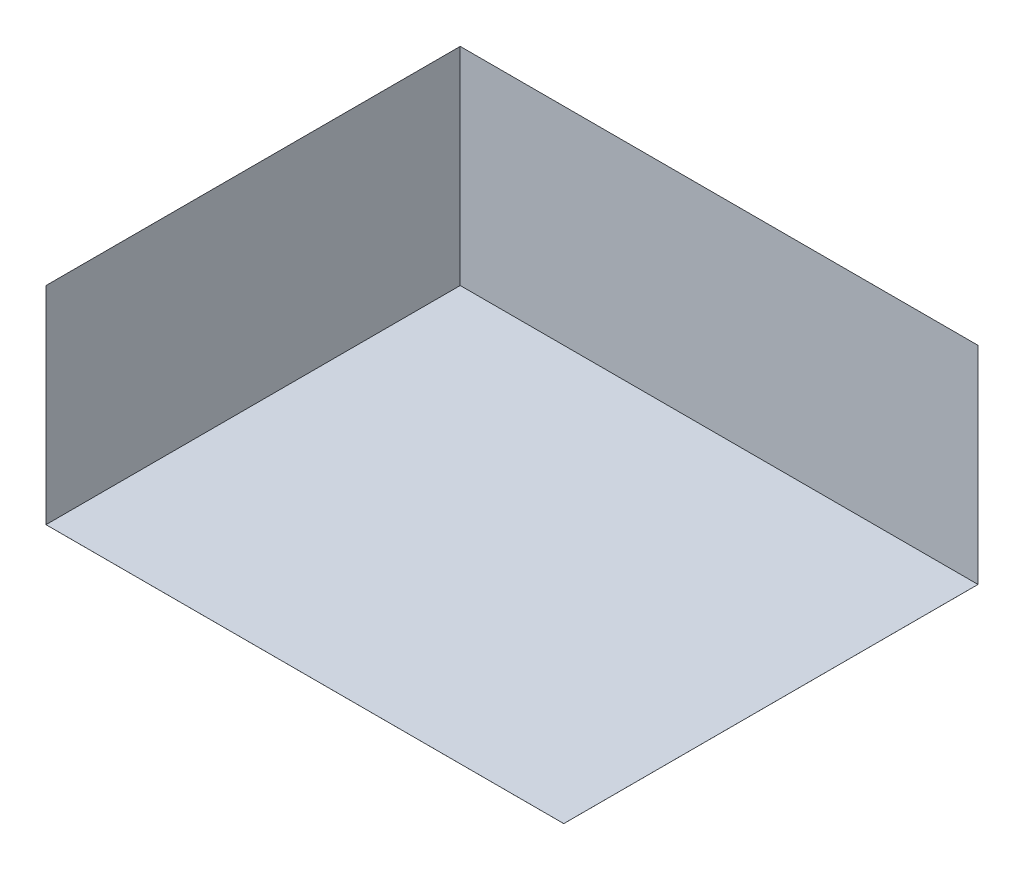
ISO-10303-21;
HEADER;
FILE_DESCRIPTION(('STEP AP214'),'2;1');
FILE_NAME('part.step','',(''),(''),'','','');
FILE_SCHEMA(('AUTOMOTIVE_DESIGN { 1 0 10303 214 1 1 1 1 }'));
ENDSEC;
DATA;
#1=APPLICATION_CONTEXT('core data for automotive mechanical design processes');
#2=APPLICATION_PROTOCOL_DEFINITION('international standard','automotive_design',2000,#1);
#3=PRODUCT_CONTEXT('',#1,'mechanical');
#4=PRODUCT('Part','Part','',(#3));
#5=PRODUCT_RELATED_PRODUCT_CATEGORY('part','',(#4));
#6=PRODUCT_DEFINITION_FORMATION('','',#4);
#7=PRODUCT_DEFINITION_CONTEXT('part definition',#1,'design');
#8=PRODUCT_DEFINITION('design','',#6,#7);
#9=PRODUCT_DEFINITION_SHAPE('','',#8);
#10=(LENGTH_UNIT() NAMED_UNIT(*) SI_UNIT(.MILLI.,.METRE.));
#11=(NAMED_UNIT(*) PLANE_ANGLE_UNIT() SI_UNIT($,.RADIAN.));
#12=(NAMED_UNIT(*) SI_UNIT($,.STERADIAN.) SOLID_ANGLE_UNIT());
#13=UNCERTAINTY_MEASURE_WITH_UNIT(LENGTH_MEASURE(1.E-05),#10,'distance_accuracy_value','');
#14=(GEOMETRIC_REPRESENTATION_CONTEXT(3) GLOBAL_UNCERTAINTY_ASSIGNED_CONTEXT((#13)) GLOBAL_UNIT_ASSIGNED_CONTEXT((#10,
#11,#12)) REPRESENTATION_CONTEXT('',''));
#15=CARTESIAN_POINT('',(0.,0.,0.));
#16=DIRECTION('',(0.,0.,1.));
#17=DIRECTION('',(1.,0.,0.));
#18=AXIS2_PLACEMENT_3D('',#15,#16,#17);
#19=CARTESIAN_POINT('',(-53.3455044386423,2000.254,-19.4976501305483));
#20=DIRECTION('',(1.,0.,0.));
#21=DIRECTION('',(0.,0.,-1.));
#22=AXIS2_PLACEMENT_3D('',#19,#20,#21);
#23=PLANE('',#22);
#24=DIRECTION('',(0.,0.,1.));
#25=VECTOR('',#24,1.);
#26=CARTESIAN_POINT('',(-53.3455044386423,0.254,-19.4976501305483));
#27=LINE('',#26,#25);
#28=CARTESIAN_POINT('',(-53.3455044386423,0.254,-19.4976501305483));
#29=VERTEX_POINT('',#28);
#30=CARTESIAN_POINT('',(-53.3455044386418,0.254,3980.50234986945));
#31=VERTEX_POINT('',#30);
#32=EDGE_CURVE('E111',#29,#31,#27,.T.);
#33=ORIENTED_EDGE('',*,*,#32,.T.);
#34=DIRECTION('',(0.,-1.,0.));
#35=VECTOR('',#34,1.);
#36=CARTESIAN_POINT('',(-53.3455044386418,2000.254,3980.50234986945));
#37=LINE('',#36,#35);
#38=CARTESIAN_POINT('',(-53.3455044386418,2000.254,3980.50234986945));
#39=VERTEX_POINT('',#38);
#40=EDGE_CURVE('E12',#39,#31,#37,.T.);
#41=ORIENTED_EDGE('',*,*,#40,.F.);
#42=DIRECTION('',(0.,0.,1.));
#43=VECTOR('',#42,1.);
#44=CARTESIAN_POINT('',(-53.3455044386423,2000.254,-19.4976501305483));
#45=LINE('',#44,#43);
#46=CARTESIAN_POINT('',(-53.3455044386423,2000.254,-19.4976501305483));
#47=VERTEX_POINT('',#46);
#48=EDGE_CURVE('E88',#47,#39,#45,.T.);
#49=ORIENTED_EDGE('',*,*,#48,.F.);
#50=DIRECTION('',(0.,-1.,0.));
#51=VECTOR('',#50,1.);
#52=CARTESIAN_POINT('',(-53.3455044386423,2000.254,-19.4976501305483));
#53=LINE('',#52,#51);
#54=EDGE_CURVE('E64',#47,#29,#53,.T.);
#55=ORIENTED_EDGE('',*,*,#54,.T.);
#56=EDGE_LOOP('',(#33,#41,#49,#55));
#57=FACE_BOUND('',#56,.T.);
#58=ADVANCED_FACE('F48',(#57),#23,.F.);
#59=CARTESIAN_POINT('',(-53.3201044386418,2000.254,3980.50234986945));
#60=DIRECTION('',(0.,0.,1.));
#61=DIRECTION('',(1.,0.,0.));
#62=AXIS2_PLACEMENT_3D('',#59,#60,#61);
#63=PLANE('',#62);
#64=DIRECTION('',(-1.,0.,0.));
#65=VECTOR('',#64,1.);
#66=CARTESIAN_POINT('',(-53.3201044386418,0.254,3980.50234986945));
#67=LINE('',#66,#65);
#68=CARTESIAN_POINT('',(-53.3201044386418,0.254,3980.50234986945));
#69=VERTEX_POINT('',#68);
#70=EDGE_CURVE('E97',#69,#31,#67,.T.);
#71=ORIENTED_EDGE('',*,*,#70,.F.);
#72=DIRECTION('',(0.,-1.,0.));
#73=VECTOR('',#72,1.);
#74=CARTESIAN_POINT('',(-53.3201044386418,2000.254,3980.50234986945));
#75=LINE('',#74,#73);
#76=CARTESIAN_POINT('',(-53.3201044386418,2000.254,3980.50234986945));
#77=VERTEX_POINT('',#76);
#78=EDGE_CURVE('E56',#77,#69,#75,.T.);
#79=ORIENTED_EDGE('',*,*,#78,.F.);
#80=DIRECTION('',(-1.,0.,0.));
#81=VECTOR('',#80,1.);
#82=CARTESIAN_POINT('',(-53.3201044386418,2000.254,3980.50234986945));
#83=LINE('',#82,#81);
#84=EDGE_CURVE('E95',#77,#39,#83,.T.);
#85=ORIENTED_EDGE('',*,*,#84,.T.);
#86=ORIENTED_EDGE('',*,*,#40,.T.);
#87=EDGE_LOOP('',(#71,#79,#85,#86));
#88=FACE_BOUND('',#87,.T.);
#89=ADVANCED_FACE('F94',(#88),#63,.T.);
#90=CARTESIAN_POINT('',(-53.3201044386423,2000.254,-19.4976501305483));
#91=DIRECTION('',(1.,0.,0.));
#92=DIRECTION('',(0.,0.,-1.));
#93=AXIS2_PLACEMENT_3D('',#90,#91,#92);
#94=PLANE('',#93);
#95=DIRECTION('',(0.,0.,1.));
#96=VECTOR('',#95,1.);
#97=CARTESIAN_POINT('',(-53.3201044386423,0.254,-19.4976501305483));
#98=LINE('',#97,#96);
#99=CARTESIAN_POINT('',(-53.3201044386423,0.254,-19.4976501305483));
#100=VERTEX_POINT('',#99);
#101=EDGE_CURVE('E114',#100,#69,#98,.T.);
#102=ORIENTED_EDGE('',*,*,#101,.F.);
#103=DIRECTION('',(0.,-1.,0.));
#104=VECTOR('',#103,1.);
#105=CARTESIAN_POINT('',(-53.3201044386423,2000.254,-19.4976501305483));
#106=LINE('',#105,#104);
#107=CARTESIAN_POINT('',(-53.3201044386423,2000.254,-19.4976501305483));
#108=VERTEX_POINT('',#107);
#109=EDGE_CURVE('E77',#108,#100,#106,.T.);
#110=ORIENTED_EDGE('',*,*,#109,.F.);
#111=DIRECTION('',(0.,0.,1.));
#112=VECTOR('',#111,1.);
#113=CARTESIAN_POINT('',(-53.3201044386423,2000.254,-19.4976501305483));
#114=LINE('',#113,#112);
#115=EDGE_CURVE('E103',#108,#77,#114,.T.);
#116=ORIENTED_EDGE('',*,*,#115,.T.);
#117=ORIENTED_EDGE('',*,*,#78,.T.);
#118=EDGE_LOOP('',(#102,#110,#116,#117));
#119=FACE_BOUND('',#118,.T.);
#120=ADVANCED_FACE('F105',(#119),#94,.T.);
#121=CARTESIAN_POINT('',(-53.3455044386423,2000.254,-19.4976501305483));
#122=DIRECTION('',(0.,0.,-1.));
#123=DIRECTION('',(-1.,0.,0.));
#124=AXIS2_PLACEMENT_3D('',#121,#122,#123);
#125=PLANE('',#124);
#126=DIRECTION('',(1.,0.,0.));
#127=VECTOR('',#126,1.);
#128=CARTESIAN_POINT('',(-53.3455044386423,0.254,-19.4976501305483));
#129=LINE('',#128,#127);
#130=EDGE_CURVE('E116',#29,#100,#129,.T.);
#131=ORIENTED_EDGE('',*,*,#130,.F.);
#132=ORIENTED_EDGE('',*,*,#54,.F.);
#133=DIRECTION('',(1.,0.,0.));
#134=VECTOR('',#133,1.);
#135=CARTESIAN_POINT('',(-53.3455044386423,2000.254,-19.4976501305483));
#136=LINE('',#135,#134);
#137=EDGE_CURVE('E106',#47,#108,#136,.T.);
#138=ORIENTED_EDGE('',*,*,#137,.T.);
#139=ORIENTED_EDGE('',*,*,#109,.T.);
#140=EDGE_LOOP('',(#131,#132,#138,#139));
#141=FACE_BOUND('',#140,.T.);
#142=ADVANCED_FACE('F122',(#141),#125,.T.);
#143=CARTESIAN_POINT('',(0.,2000.254,0.));
#144=DIRECTION('',(0.,-1.,0.));
#145=DIRECTION('',(-1.,0.,0.));
#146=AXIS2_PLACEMENT_3D('',#143,#144,#145);
#147=PLANE('',#146);
#148=ORIENTED_EDGE('',*,*,#48,.T.);
#149=ORIENTED_EDGE('',*,*,#84,.F.);
#150=ORIENTED_EDGE('',*,*,#115,.F.);
#151=ORIENTED_EDGE('',*,*,#137,.F.);
#152=EDGE_LOOP('',(#148,#149,#150,#151));
#153=FACE_BOUND('',#152,.T.);
#154=ADVANCED_FACE('F102',(#153),#147,.F.);
#155=CARTESIAN_POINT('',(0.,0.254,0.));
#156=DIRECTION('',(0.,-1.,0.));
#157=DIRECTION('',(-1.,0.,0.));
#158=AXIS2_PLACEMENT_3D('',#155,#156,#157);
#159=PLANE('',#158);
#160=ORIENTED_EDGE('',*,*,#32,.F.);
#161=ORIENTED_EDGE('',*,*,#130,.T.);
#162=ORIENTED_EDGE('',*,*,#101,.T.);
#163=ORIENTED_EDGE('',*,*,#70,.T.);
#164=EDGE_LOOP('',(#160,#161,#162,#163));
#165=FACE_BOUND('',#164,.T.);
#166=ADVANCED_FACE('F121',(#165),#159,.T.);
#167=CLOSED_SHELL('',(#58,#89,#120,#142,#154,#166));
#168=MANIFOLD_SOLID_BREP('B2',#167);
#169=CARTESIAN_POINT('',(4946.67989556137,2000.254,-19.5230501305483));
#170=DIRECTION('',(0.,0.,1.));
#171=DIRECTION('',(1.,0.,0.));
#172=AXIS2_PLACEMENT_3D('',#169,#170,#171);
#173=PLANE('',#172);
#174=DIRECTION('',(1.,0.,0.));
#175=VECTOR('',#174,1.);
#176=CARTESIAN_POINT('',(4946.67989556137,0.254,-19.5230501305483));
#177=LINE('',#176,#175);
#178=CARTESIAN_POINT('',(4946.67989556137,0.254,-19.5230501305483));
#179=VERTEX_POINT('',#178);
#180=CARTESIAN_POINT('',(-53.320104438642,0.254,-19.5230501305483));
#181=VERTEX_POINT('',#180);
#182=EDGE_CURVE('E256',#179,#181,#177,.F.);
#183=ORIENTED_EDGE('',*,*,#182,.T.);
#184=DIRECTION('',(0.,-1.,0.));
#185=VECTOR('',#184,1.);
#186=CARTESIAN_POINT('',(-53.320104438642,2000.254,-19.5230501305483));
#187=LINE('',#186,#185);
#188=CARTESIAN_POINT('',(-53.320104438642,2000.254,-19.5230501305483));
#189=VERTEX_POINT('',#188);
#190=EDGE_CURVE('E46',#189,#181,#187,.T.);
#191=ORIENTED_EDGE('',*,*,#190,.F.);
#192=DIRECTION('',(1.,0.,0.));
#193=VECTOR('',#192,1.);
#194=CARTESIAN_POINT('',(4946.67989556137,2000.254,-19.5230501305483));
#195=LINE('',#194,#193);
#196=CARTESIAN_POINT('',(4946.67989556137,2000.254,-19.5230501305483));
#197=VERTEX_POINT('',#196);
#198=EDGE_CURVE('E233',#197,#189,#195,.F.);
#199=ORIENTED_EDGE('',*,*,#198,.F.);
#200=DIRECTION('',(0.,-1.,0.));
#201=VECTOR('',#200,1.);
#202=CARTESIAN_POINT('',(4946.67989556137,2000.254,-19.5230501305483));
#203=LINE('',#202,#201);
#204=EDGE_CURVE('E209',#197,#179,#203,.T.);
#205=ORIENTED_EDGE('',*,*,#204,.T.);
#206=EDGE_LOOP('',(#183,#191,#199,#205));
#207=FACE_BOUND('',#206,.T.);
#208=ADVANCED_FACE('F193',(#207),#173,.F.);
#209=CARTESIAN_POINT('',(-53.3201044386423,2000.254,-19.4976501305483));
#210=DIRECTION('',(-1.,0.,-1.20201311721235E-11));
#211=DIRECTION('',(-1.20201311721235E-11,0.,1.));
#212=AXIS2_PLACEMENT_3D('',#209,#210,#211);
#213=PLANE('',#212);
#214=DIRECTION('',(1.20201311721235E-11,0.,-1.));
#215=VECTOR('',#214,1.);
#216=CARTESIAN_POINT('',(-53.3201044386423,0.254,-19.4976501305483));
#217=LINE('',#216,#215);
#218=CARTESIAN_POINT('',(-53.3201044386423,0.254,-19.4976501305483));
#219=VERTEX_POINT('',#218);
#220=EDGE_CURVE('E242',#219,#181,#217,.T.);
#221=ORIENTED_EDGE('',*,*,#220,.F.);
#222=DIRECTION('',(0.,-1.,0.));
#223=VECTOR('',#222,1.);
#224=CARTESIAN_POINT('',(-53.3201044386423,2000.254,-19.4976501305483));
#225=LINE('',#224,#223);
#226=CARTESIAN_POINT('',(-53.3201044386423,2000.254,-19.4976501305483));
#227=VERTEX_POINT('',#226);
#228=EDGE_CURVE('E201',#227,#219,#225,.T.);
#229=ORIENTED_EDGE('',*,*,#228,.F.);
#230=DIRECTION('',(1.20201311721235E-11,0.,-1.));
#231=VECTOR('',#230,1.);
#232=CARTESIAN_POINT('',(-53.3201044386423,2000.254,-19.4976501305483));
#233=LINE('',#232,#231);
#234=EDGE_CURVE('E240',#227,#189,#233,.T.);
#235=ORIENTED_EDGE('',*,*,#234,.T.);
#236=ORIENTED_EDGE('',*,*,#190,.T.);
#237=EDGE_LOOP('',(#221,#229,#235,#236));
#238=FACE_BOUND('',#237,.T.);
#239=ADVANCED_FACE('F239',(#238),#213,.T.);
#240=CARTESIAN_POINT('',(4946.67989556137,2000.254,-19.4976501305483));
#241=DIRECTION('',(0.,0.,1.));
#242=DIRECTION('',(1.,0.,0.));
#243=AXIS2_PLACEMENT_3D('',#240,#241,#242);
#244=PLANE('',#243);
#245=DIRECTION('',(-1.,0.,0.));
#246=VECTOR('',#245,1.);
#247=CARTESIAN_POINT('',(4946.67989556137,0.254,-19.4976501305483));
#248=LINE('',#247,#246);
#249=CARTESIAN_POINT('',(4946.67989556137,0.254,-19.4976501305483));
#250=VERTEX_POINT('',#249);
#251=EDGE_CURVE('E259',#250,#219,#248,.T.);
#252=ORIENTED_EDGE('',*,*,#251,.F.);
#253=DIRECTION('',(0.,-1.,0.));
#254=VECTOR('',#253,1.);
#255=CARTESIAN_POINT('',(4946.67989556137,2000.254,-19.4976501305483));
#256=LINE('',#255,#254);
#257=CARTESIAN_POINT('',(4946.67989556137,2000.254,-19.4976501305483));
#258=VERTEX_POINT('',#257);
#259=EDGE_CURVE('E222',#258,#250,#256,.T.);
#260=ORIENTED_EDGE('',*,*,#259,.F.);
#261=DIRECTION('',(-1.,0.,0.));
#262=VECTOR('',#261,1.);
#263=CARTESIAN_POINT('',(4946.67989556137,2000.254,-19.4976501305483));
#264=LINE('',#263,#262);
#265=EDGE_CURVE('E248',#258,#227,#264,.T.);
#266=ORIENTED_EDGE('',*,*,#265,.T.);
#267=ORIENTED_EDGE('',*,*,#228,.T.);
#268=EDGE_LOOP('',(#252,#260,#266,#267));
#269=FACE_BOUND('',#268,.T.);
#270=ADVANCED_FACE('F250',(#269),#244,.T.);
#271=CARTESIAN_POINT('',(4946.67989556137,2000.254,-19.5230501305483));
#272=DIRECTION('',(1.,0.,0.));
#273=DIRECTION('',(0.,0.,-1.));
#274=AXIS2_PLACEMENT_3D('',#271,#272,#273);
#275=PLANE('',#274);
#276=DIRECTION('',(0.,0.,1.));
#277=VECTOR('',#276,1.);
#278=CARTESIAN_POINT('',(4946.67989556137,0.254,-19.5230501305483));
#279=LINE('',#278,#277);
#280=EDGE_CURVE('E261',#179,#250,#279,.T.);
#281=ORIENTED_EDGE('',*,*,#280,.F.);
#282=ORIENTED_EDGE('',*,*,#204,.F.);
#283=DIRECTION('',(0.,0.,1.));
#284=VECTOR('',#283,1.);
#285=CARTESIAN_POINT('',(4946.67989556137,2000.254,-19.5230501305483));
#286=LINE('',#285,#284);
#287=EDGE_CURVE('E251',#197,#258,#286,.T.);
#288=ORIENTED_EDGE('',*,*,#287,.T.);
#289=ORIENTED_EDGE('',*,*,#259,.T.);
#290=EDGE_LOOP('',(#281,#282,#288,#289));
#291=FACE_BOUND('',#290,.T.);
#292=ADVANCED_FACE('F267',(#291),#275,.T.);
#293=CARTESIAN_POINT('',(0.,2000.254,0.));
#294=DIRECTION('',(0.,-1.,0.));
#295=DIRECTION('',(-1.,0.,0.));
#296=AXIS2_PLACEMENT_3D('',#293,#294,#295);
#297=PLANE('',#296);
#298=ORIENTED_EDGE('',*,*,#198,.T.);
#299=ORIENTED_EDGE('',*,*,#234,.F.);
#300=ORIENTED_EDGE('',*,*,#265,.F.);
#301=ORIENTED_EDGE('',*,*,#287,.F.);
#302=EDGE_LOOP('',(#298,#299,#300,#301));
#303=FACE_BOUND('',#302,.T.);
#304=ADVANCED_FACE('F247',(#303),#297,.F.);
#305=CARTESIAN_POINT('',(0.,0.254,0.));
#306=DIRECTION('',(0.,-1.,0.));
#307=DIRECTION('',(-1.,0.,0.));
#308=AXIS2_PLACEMENT_3D('',#305,#306,#307);
#309=PLANE('',#308);
#310=ORIENTED_EDGE('',*,*,#182,.F.);
#311=ORIENTED_EDGE('',*,*,#280,.T.);
#312=ORIENTED_EDGE('',*,*,#251,.T.);
#313=ORIENTED_EDGE('',*,*,#220,.T.);
#314=EDGE_LOOP('',(#310,#311,#312,#313));
#315=FACE_BOUND('',#314,.T.);
#316=ADVANCED_FACE('F266',(#315),#309,.T.);
#317=CLOSED_SHELL('',(#208,#239,#270,#292,#304,#316));
#318=MANIFOLD_SOLID_BREP('B6',#317);
#319=CARTESIAN_POINT('',(-53.3201044386423,0.254,-19.4976501305483));
#320=DIRECTION('',(1.,0.,0.));
#321=DIRECTION('',(0.,0.,-1.));
#322=AXIS2_PLACEMENT_3D('',#319,#320,#321);
#323=PLANE('',#322);
#324=DIRECTION('',(0.,0.,1.));
#325=VECTOR('',#324,1.);
#326=CARTESIAN_POINT('',(-53.3201044386423,0.,-19.4976501305483));
#327=LINE('',#326,#325);
#328=CARTESIAN_POINT('',(-53.3201044386423,0.,-19.4976501305483));
#329=VERTEX_POINT('',#328);
#330=CARTESIAN_POINT('',(-53.3201044386418,0.,3980.50234986945));
#331=VERTEX_POINT('',#330);
#332=EDGE_CURVE('E392',#329,#331,#327,.T.);
#333=ORIENTED_EDGE('',*,*,#332,.T.);
#334=DIRECTION('',(0.,-1.,0.));
#335=VECTOR('',#334,1.);
#336=CARTESIAN_POINT('',(-53.3201044386418,0.254,3980.50234986945));
#337=LINE('',#336,#335);
#338=CARTESIAN_POINT('',(-53.3201044386418,0.254,3980.50234986945));
#339=VERTEX_POINT('',#338);
#340=EDGE_CURVE('E191',#339,#331,#337,.T.);
#341=ORIENTED_EDGE('',*,*,#340,.F.);
#342=DIRECTION('',(0.,0.,1.));
#343=VECTOR('',#342,1.);
#344=CARTESIAN_POINT('',(-53.3201044386423,0.254,-19.4976501305483));
#345=LINE('',#344,#343);
#346=CARTESIAN_POINT('',(-53.3201044386423,0.254,-19.4976501305483));
#347=VERTEX_POINT('',#346);
#348=EDGE_CURVE('E380',#347,#339,#345,.T.);
#349=ORIENTED_EDGE('',*,*,#348,.F.);
#350=DIRECTION('',(0.,-1.,0.));
#351=VECTOR('',#350,1.);
#352=CARTESIAN_POINT('',(-53.3201044386423,0.254,-19.4976501305483));
#353=LINE('',#352,#351);
#354=EDGE_CURVE('E388',#347,#329,#353,.T.);
#355=ORIENTED_EDGE('',*,*,#354,.T.);
#356=EDGE_LOOP('',(#333,#341,#349,#355));
#357=FACE_BOUND('',#356,.T.);
#358=ADVANCED_FACE('F329',(#357),#323,.F.);
#359=CARTESIAN_POINT('',(-53.3201044386418,0.254,3980.50234986945));
#360=DIRECTION('',(0.,0.,-1.));
#361=DIRECTION('',(-1.,0.,0.));
#362=AXIS2_PLACEMENT_3D('',#359,#360,#361);
#363=PLANE('',#362);
#364=DIRECTION('',(1.,0.,0.));
#365=VECTOR('',#364,1.);
#366=CARTESIAN_POINT('',(-53.3201044386418,0.,3980.50234986945));
#367=LINE('',#366,#365);
#368=CARTESIAN_POINT('',(4946.67989556136,0.,3980.50234986945));
#369=VERTEX_POINT('',#368);
#370=EDGE_CURVE('E384',#331,#369,#367,.T.);
#371=ORIENTED_EDGE('',*,*,#370,.T.);
#372=DIRECTION('',(0.,-1.,0.));
#373=VECTOR('',#372,1.);
#374=CARTESIAN_POINT('',(4946.67989556136,0.254,3980.50234986945));
#375=LINE('',#374,#373);
#376=CARTESIAN_POINT('',(4946.67989556136,0.254,3980.50234986945));
#377=VERTEX_POINT('',#376);
#378=EDGE_CURVE('E337',#377,#369,#375,.T.);
#379=ORIENTED_EDGE('',*,*,#378,.F.);
#380=DIRECTION('',(1.,0.,0.));
#381=VECTOR('',#380,1.);
#382=CARTESIAN_POINT('',(-53.3201044386418,0.254,3980.50234986945));
#383=LINE('',#382,#381);
#384=EDGE_CURVE('E375',#339,#377,#383,.T.);
#385=ORIENTED_EDGE('',*,*,#384,.F.);
#386=ORIENTED_EDGE('',*,*,#340,.T.);
#387=EDGE_LOOP('',(#371,#379,#385,#386));
#388=FACE_BOUND('',#387,.T.);
#389=ADVANCED_FACE('F383',(#388),#363,.F.);
#390=CARTESIAN_POINT('',(4946.67989556137,0.254,-19.4976501305483));
#391=DIRECTION('',(-1.,0.,0.));
#392=DIRECTION('',(0.,0.,1.));
#393=AXIS2_PLACEMENT_3D('',#390,#391,#392);
#394=PLANE('',#393);
#395=DIRECTION('',(0.,0.,-1.));
#396=VECTOR('',#395,1.);
#397=CARTESIAN_POINT('',(4946.67989556137,0.,-19.4976501305483));
#398=LINE('',#397,#396);
#399=CARTESIAN_POINT('',(4946.67989556137,0.,-19.4976501305483));
#400=VERTEX_POINT('',#399);
#401=EDGE_CURVE('E362',#369,#400,#398,.T.);
#402=ORIENTED_EDGE('',*,*,#401,.T.);
#403=DIRECTION('',(0.,-1.,0.));
#404=VECTOR('',#403,1.);
#405=CARTESIAN_POINT('',(4946.67989556137,0.254,-19.4976501305483));
#406=LINE('',#405,#404);
#407=CARTESIAN_POINT('',(4946.67989556137,0.254,-19.4976501305483));
#408=VERTEX_POINT('',#407);
#409=EDGE_CURVE('E385',#408,#400,#406,.T.);
#410=ORIENTED_EDGE('',*,*,#409,.F.);
#411=DIRECTION('',(0.,0.,-1.));
#412=VECTOR('',#411,1.);
#413=CARTESIAN_POINT('',(4946.67989556137,0.254,-19.4976501305483));
#414=LINE('',#413,#412);
#415=EDGE_CURVE('E378',#377,#408,#414,.T.);
#416=ORIENTED_EDGE('',*,*,#415,.F.);
#417=ORIENTED_EDGE('',*,*,#378,.T.);
#418=EDGE_LOOP('',(#402,#410,#416,#417));
#419=FACE_BOUND('',#418,.T.);
#420=ADVANCED_FACE('F386',(#419),#394,.F.);
#421=CARTESIAN_POINT('',(-53.3201044386423,0.254,-19.4976501305483));
#422=DIRECTION('',(0.,0.,1.));
#423=DIRECTION('',(1.,0.,0.));
#424=AXIS2_PLACEMENT_3D('',#421,#422,#423);
#425=PLANE('',#424);
#426=DIRECTION('',(-1.,0.,0.));
#427=VECTOR('',#426,1.);
#428=CARTESIAN_POINT('',(-53.3201044386423,0.,-19.4976501305483));
#429=LINE('',#428,#427);
#430=EDGE_CURVE('E368',#400,#329,#429,.T.);
#431=ORIENTED_EDGE('',*,*,#430,.T.);
#432=ORIENTED_EDGE('',*,*,#354,.F.);
#433=DIRECTION('',(-1.,0.,0.));
#434=VECTOR('',#433,1.);
#435=CARTESIAN_POINT('',(-53.3201044386423,0.254,-19.4976501305483));
#436=LINE('',#435,#434);
#437=EDGE_CURVE('E345',#408,#347,#436,.T.);
#438=ORIENTED_EDGE('',*,*,#437,.F.);
#439=ORIENTED_EDGE('',*,*,#409,.T.);
#440=EDGE_LOOP('',(#431,#432,#438,#439));
#441=FACE_BOUND('',#440,.T.);
#442=ADVANCED_FACE('F399',(#441),#425,.F.);
#443=CARTESIAN_POINT('',(0.,0.254,0.));
#444=DIRECTION('',(0.,1.,0.));
#445=DIRECTION('',(0.,0.,1.));
#446=AXIS2_PLACEMENT_3D('',#443,#444,#445);
#447=PLANE('',#446);
#448=ORIENTED_EDGE('',*,*,#348,.T.);
#449=ORIENTED_EDGE('',*,*,#384,.T.);
#450=ORIENTED_EDGE('',*,*,#415,.T.);
#451=ORIENTED_EDGE('',*,*,#437,.T.);
#452=EDGE_LOOP('',(#448,#449,#450,#451));
#453=FACE_BOUND('',#452,.T.);
#454=ADVANCED_FACE('F376',(#453),#447,.T.);
#455=CARTESIAN_POINT('',(0.,0.,0.));
#456=DIRECTION('',(0.,1.,0.));
#457=DIRECTION('',(0.,0.,1.));
#458=AXIS2_PLACEMENT_3D('',#455,#456,#457);
#459=PLANE('',#458);
#460=ORIENTED_EDGE('',*,*,#332,.F.);
#461=ORIENTED_EDGE('',*,*,#430,.F.);
#462=ORIENTED_EDGE('',*,*,#401,.F.);
#463=ORIENTED_EDGE('',*,*,#370,.F.);
#464=EDGE_LOOP('',(#460,#461,#462,#463));
#465=FACE_BOUND('',#464,.T.);
#466=ADVANCED_FACE('F402',(#465),#459,.F.);
#467=CLOSED_SHELL('',(#358,#389,#420,#442,#454,#466));
#468=MANIFOLD_SOLID_BREP('B40',#467);
#469=ADVANCED_BREP_SHAPE_REPRESENTATION('',(#18,#168,#318,#468),#14);
#470=SHAPE_DEFINITION_REPRESENTATION(#9,#469);
ENDSEC;
END-ISO-10303-21;
